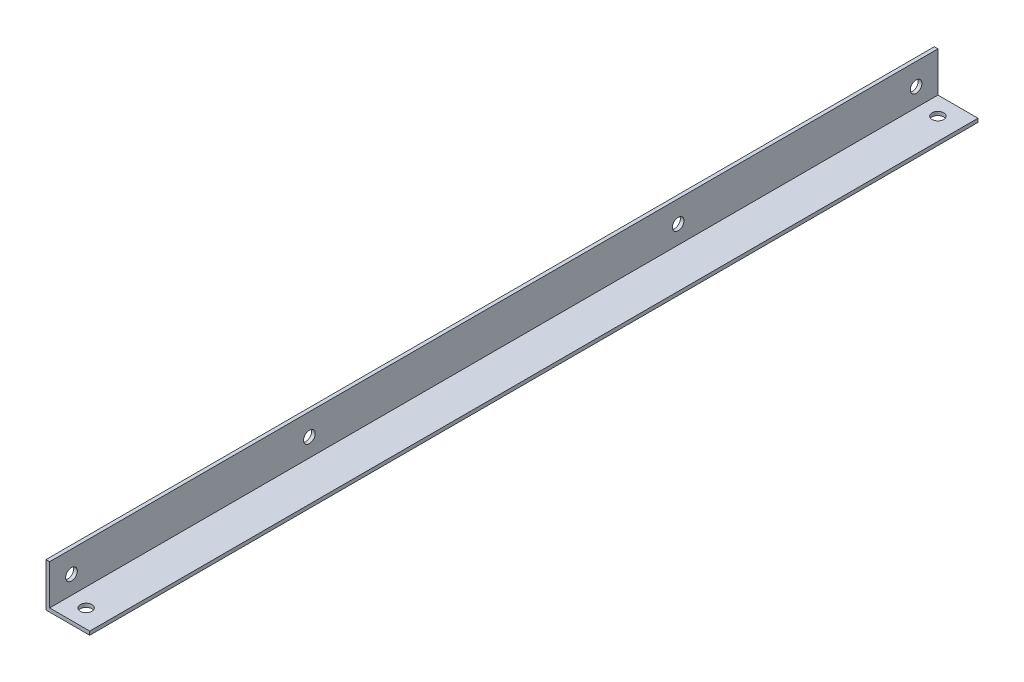
ISO-10303-21;
HEADER;
FILE_DESCRIPTION(('STEP AP214'),'2;1');
FILE_NAME('part.step','',(''),(''),'','','');
FILE_SCHEMA(('AUTOMOTIVE_DESIGN { 1 0 10303 214 1 1 1 1 }'));
ENDSEC;
DATA;
#1=APPLICATION_CONTEXT('core data for automotive mechanical design processes');
#2=APPLICATION_PROTOCOL_DEFINITION('international standard','automotive_design',2000,#1);
#3=PRODUCT_CONTEXT('',#1,'mechanical');
#4=PRODUCT('Part','Part','',(#3));
#5=PRODUCT_RELATED_PRODUCT_CATEGORY('part','',(#4));
#6=PRODUCT_DEFINITION_FORMATION('','',#4);
#7=PRODUCT_DEFINITION_CONTEXT('part definition',#1,'design');
#8=PRODUCT_DEFINITION('design','',#6,#7);
#9=PRODUCT_DEFINITION_SHAPE('','',#8);
#10=(LENGTH_UNIT() NAMED_UNIT(*) SI_UNIT(.MILLI.,.METRE.));
#11=(NAMED_UNIT(*) PLANE_ANGLE_UNIT() SI_UNIT($,.RADIAN.));
#12=(NAMED_UNIT(*) SI_UNIT($,.STERADIAN.) SOLID_ANGLE_UNIT());
#13=UNCERTAINTY_MEASURE_WITH_UNIT(LENGTH_MEASURE(1.E-05),#10,'distance_accuracy_value','');
#14=(GEOMETRIC_REPRESENTATION_CONTEXT(3) GLOBAL_UNCERTAINTY_ASSIGNED_CONTEXT((#13)) GLOBAL_UNIT_ASSIGNED_CONTEXT((#10,
#11,#12)) REPRESENTATION_CONTEXT('',''));
#15=CARTESIAN_POINT('',(0.,0.,0.));
#16=DIRECTION('',(0.,0.,1.));
#17=DIRECTION('',(1.,0.,0.));
#18=AXIS2_PLACEMENT_3D('',#15,#16,#17);
#19=CARTESIAN_POINT('',(30.,0.,609.6));
#20=DIRECTION('',(0.,1.,0.));
#21=DIRECTION('',(-1.,0.,0.));
#22=AXIS2_PLACEMENT_3D('',#19,#20,#21);
#23=PLANE('',#22);
#24=CARTESIAN_POINT('',(15.,0.,597.1));
#25=DIRECTION('',(0.,1.,0.));
#26=DIRECTION('',(1.,0.,0.));
#27=AXIS2_PLACEMENT_3D('',#24,#25,#26);
#28=CIRCLE('',#27,3.99999999999995);
#29=CARTESIAN_POINT('',(11.,0.,597.1));
#30=VERTEX_POINT('',#29);
#31=EDGE_CURVE('E162',#30,#30,#28,.T.);
#32=ORIENTED_EDGE('',*,*,#31,.T.);
#33=EDGE_LOOP('',(#32));
#34=FACE_BOUND('',#33,.T.);
#35=CARTESIAN_POINT('',(15.,0.,12.5));
#36=DIRECTION('',(0.,1.,0.));
#37=DIRECTION('',(-1.,0.,0.));
#38=AXIS2_PLACEMENT_3D('',#35,#36,#37);
#39=CIRCLE('',#38,4.);
#40=CARTESIAN_POINT('',(11.,0.,12.5));
#41=VERTEX_POINT('',#40);
#42=EDGE_CURVE('E165',#41,#41,#39,.T.);
#43=ORIENTED_EDGE('',*,*,#42,.T.);
#44=EDGE_LOOP('',(#43));
#45=FACE_BOUND('',#44,.T.);
#46=DIRECTION('',(1.,0.,0.));
#47=VECTOR('',#46,1.);
#48=CARTESIAN_POINT('',(30.,0.,0.));
#49=LINE('',#48,#47);
#50=CARTESIAN_POINT('',(0.,0.,0.));
#51=VERTEX_POINT('',#50);
#52=CARTESIAN_POINT('',(30.,0.,0.));
#53=VERTEX_POINT('',#52);
#54=EDGE_CURVE('E116',#51,#53,#49,.T.);
#55=ORIENTED_EDGE('',*,*,#54,.T.);
#56=DIRECTION('',(0.,0.,-1.));
#57=VECTOR('',#56,1.);
#58=CARTESIAN_POINT('',(30.,0.,609.6));
#59=LINE('',#58,#57);
#60=CARTESIAN_POINT('',(30.,0.,609.6));
#61=VERTEX_POINT('',#60);
#62=EDGE_CURVE('E11',#61,#53,#59,.T.);
#63=ORIENTED_EDGE('',*,*,#62,.F.);
#64=DIRECTION('',(1.,0.,0.));
#65=VECTOR('',#64,1.);
#66=CARTESIAN_POINT('',(30.,0.,609.6));
#67=LINE('',#66,#65);
#68=CARTESIAN_POINT('',(0.,0.,609.6));
#69=VERTEX_POINT('',#68);
#70=EDGE_CURVE('E127',#69,#61,#67,.T.);
#71=ORIENTED_EDGE('',*,*,#70,.F.);
#72=DIRECTION('',(0.,0.,-1.));
#73=VECTOR('',#72,1.);
#74=CARTESIAN_POINT('',(0.,0.,609.6));
#75=LINE('',#74,#73);
#76=EDGE_CURVE('E112',#69,#51,#75,.T.);
#77=ORIENTED_EDGE('',*,*,#76,.T.);
#78=EDGE_LOOP('',(#55,#63,#71,#77));
#79=FACE_BOUND('',#78,.T.);
#80=ADVANCED_FACE('F32',(#34,#45,#79),#23,.F.);
#81=CARTESIAN_POINT('',(30.,2.5,609.6));
#82=DIRECTION('',(-1.,0.,0.));
#83=DIRECTION('',(0.,0.,1.));
#84=AXIS2_PLACEMENT_3D('',#81,#82,#83);
#85=PLANE('',#84);
#86=DIRECTION('',(0.,1.,0.));
#87=VECTOR('',#86,1.);
#88=CARTESIAN_POINT('',(30.,2.5,0.));
#89=LINE('',#88,#87);
#90=CARTESIAN_POINT('',(30.,2.5,0.));
#91=VERTEX_POINT('',#90);
#92=EDGE_CURVE('E119',#53,#91,#89,.T.);
#93=ORIENTED_EDGE('',*,*,#92,.T.);
#94=DIRECTION('',(0.,0.,-1.));
#95=VECTOR('',#94,1.);
#96=CARTESIAN_POINT('',(30.,2.5,609.6));
#97=LINE('',#96,#95);
#98=CARTESIAN_POINT('',(30.,2.5,609.6));
#99=VERTEX_POINT('',#98);
#100=EDGE_CURVE('E40',#99,#91,#97,.T.);
#101=ORIENTED_EDGE('',*,*,#100,.F.);
#102=DIRECTION('',(0.,1.,0.));
#103=VECTOR('',#102,1.);
#104=CARTESIAN_POINT('',(30.,2.5,609.6));
#105=LINE('',#104,#103);
#106=EDGE_CURVE('E85',#61,#99,#105,.T.);
#107=ORIENTED_EDGE('',*,*,#106,.F.);
#108=ORIENTED_EDGE('',*,*,#62,.T.);
#109=EDGE_LOOP('',(#93,#101,#107,#108));
#110=FACE_BOUND('',#109,.T.);
#111=ADVANCED_FACE('F154',(#110),#85,.F.);
#112=CARTESIAN_POINT('',(2.50000000000001,2.5,609.6));
#113=DIRECTION('',(0.,-1.,0.));
#114=DIRECTION('',(1.,0.,0.));
#115=AXIS2_PLACEMENT_3D('',#112,#113,#114);
#116=PLANE('',#115);
#117=CARTESIAN_POINT('',(15.,2.5,597.1));
#118=DIRECTION('',(0.,1.,0.));
#119=DIRECTION('',(1.,0.,0.));
#120=AXIS2_PLACEMENT_3D('',#117,#118,#119);
#121=CIRCLE('',#120,3.99999999999995);
#122=CARTESIAN_POINT('',(11.,2.5,597.1));
#123=VERTEX_POINT('',#122);
#124=EDGE_CURVE('E176',#123,#123,#121,.T.);
#125=ORIENTED_EDGE('',*,*,#124,.F.);
#126=EDGE_LOOP('',(#125));
#127=FACE_BOUND('',#126,.T.);
#128=CARTESIAN_POINT('',(15.,2.5,12.5));
#129=DIRECTION('',(0.,1.,0.));
#130=DIRECTION('',(-1.,0.,0.));
#131=AXIS2_PLACEMENT_3D('',#128,#129,#130);
#132=CIRCLE('',#131,4.);
#133=CARTESIAN_POINT('',(11.,2.5,12.5));
#134=VERTEX_POINT('',#133);
#135=EDGE_CURVE('E168',#134,#134,#132,.T.);
#136=ORIENTED_EDGE('',*,*,#135,.F.);
#137=EDGE_LOOP('',(#136));
#138=FACE_BOUND('',#137,.T.);
#139=DIRECTION('',(-1.,0.,0.));
#140=VECTOR('',#139,1.);
#141=CARTESIAN_POINT('',(2.50000000000001,2.5,0.));
#142=LINE('',#141,#140);
#143=CARTESIAN_POINT('',(2.50000000000001,2.5,0.));
#144=VERTEX_POINT('',#143);
#145=EDGE_CURVE('E122',#91,#144,#142,.T.);
#146=ORIENTED_EDGE('',*,*,#145,.T.);
#147=DIRECTION('',(0.,0.,-1.));
#148=VECTOR('',#147,1.);
#149=CARTESIAN_POINT('',(2.50000000000001,2.5,609.6));
#150=LINE('',#149,#148);
#151=CARTESIAN_POINT('',(2.50000000000001,2.5,609.6));
#152=VERTEX_POINT('',#151);
#153=EDGE_CURVE('E107',#152,#144,#150,.T.);
#154=ORIENTED_EDGE('',*,*,#153,.F.);
#155=DIRECTION('',(-1.,0.,0.));
#156=VECTOR('',#155,1.);
#157=CARTESIAN_POINT('',(2.50000000000001,2.5,609.6));
#158=LINE('',#157,#156);
#159=EDGE_CURVE('E98',#99,#152,#158,.T.);
#160=ORIENTED_EDGE('',*,*,#159,.F.);
#161=ORIENTED_EDGE('',*,*,#100,.T.);
#162=EDGE_LOOP('',(#146,#154,#160,#161));
#163=FACE_BOUND('',#162,.T.);
#164=ADVANCED_FACE('F133',(#127,#138,#163),#116,.F.);
#165=CARTESIAN_POINT('',(2.5,30.,609.6));
#166=DIRECTION('',(-1.,0.,0.));
#167=DIRECTION('',(0.,-1.,0.));
#168=AXIS2_PLACEMENT_3D('',#165,#166,#167);
#169=PLANE('',#168);
#170=CARTESIAN_POINT('',(2.5,15.,178.2565237));
#171=DIRECTION('',(1.,0.,0.));
#172=DIRECTION('',(0.,-1.,0.));
#173=AXIS2_PLACEMENT_3D('',#170,#171,#172);
#174=CIRCLE('',#173,3.99999999999999);
#175=CARTESIAN_POINT('',(2.5,11.,178.2565237));
#176=VERTEX_POINT('',#175);
#177=EDGE_CURVE('E167',#176,#176,#174,.T.);
#178=ORIENTED_EDGE('',*,*,#177,.F.);
#179=EDGE_LOOP('',(#178));
#180=FACE_BOUND('',#179,.T.);
#181=CARTESIAN_POINT('',(2.5,15.,431.3434763));
#182=DIRECTION('',(1.,0.,0.));
#183=DIRECTION('',(0.,1.,0.));
#184=AXIS2_PLACEMENT_3D('',#181,#182,#183);
#185=CIRCLE('',#184,3.99999999999999);
#186=CARTESIAN_POINT('',(2.5,19.,431.3434763));
#187=VERTEX_POINT('',#186);
#188=EDGE_CURVE('E179',#187,#187,#185,.T.);
#189=ORIENTED_EDGE('',*,*,#188,.F.);
#190=EDGE_LOOP('',(#189));
#191=FACE_BOUND('',#190,.T.);
#192=CARTESIAN_POINT('',(2.5,15.,15.));
#193=DIRECTION('',(1.,0.,0.));
#194=DIRECTION('',(0.,-1.,0.));
#195=AXIS2_PLACEMENT_3D('',#192,#193,#194);
#196=CIRCLE('',#195,3.99999999999999);
#197=CARTESIAN_POINT('',(2.5,11.,15.));
#198=VERTEX_POINT('',#197);
#199=EDGE_CURVE('E184',#198,#198,#196,.T.);
#200=ORIENTED_EDGE('',*,*,#199,.F.);
#201=EDGE_LOOP('',(#200));
#202=FACE_BOUND('',#201,.T.);
#203=CARTESIAN_POINT('',(2.5,14.9999999999999,594.6));
#204=DIRECTION('',(1.,0.,0.));
#205=DIRECTION('',(0.,1.,0.));
#206=AXIS2_PLACEMENT_3D('',#203,#204,#205);
#207=CIRCLE('',#206,3.99999999999999);
#208=CARTESIAN_POINT('',(2.5,18.9999999999999,594.6));
#209=VERTEX_POINT('',#208);
#210=EDGE_CURVE('E190',#209,#209,#207,.T.);
#211=ORIENTED_EDGE('',*,*,#210,.F.);
#212=EDGE_LOOP('',(#211));
#213=FACE_BOUND('',#212,.T.);
#214=DIRECTION('',(0.,1.,0.));
#215=VECTOR('',#214,1.);
#216=CARTESIAN_POINT('',(2.5,30.,0.));
#217=LINE('',#216,#215);
#218=CARTESIAN_POINT('',(2.5,30.,0.));
#219=VERTEX_POINT('',#218);
#220=EDGE_CURVE('E106',#144,#219,#217,.T.);
#221=ORIENTED_EDGE('',*,*,#220,.T.);
#222=DIRECTION('',(0.,0.,-1.));
#223=VECTOR('',#222,1.);
#224=CARTESIAN_POINT('',(2.5,30.,609.6));
#225=LINE('',#224,#223);
#226=CARTESIAN_POINT('',(2.5,30.,609.6));
#227=VERTEX_POINT('',#226);
#228=EDGE_CURVE('E103',#227,#219,#225,.T.);
#229=ORIENTED_EDGE('',*,*,#228,.F.);
#230=DIRECTION('',(0.,1.,0.));
#231=VECTOR('',#230,1.);
#232=CARTESIAN_POINT('',(2.5,30.,609.6));
#233=LINE('',#232,#231);
#234=EDGE_CURVE('E92',#152,#227,#233,.T.);
#235=ORIENTED_EDGE('',*,*,#234,.F.);
#236=ORIENTED_EDGE('',*,*,#153,.T.);
#237=EDGE_LOOP('',(#221,#229,#235,#236));
#238=FACE_BOUND('',#237,.T.);
#239=ADVANCED_FACE('F104',(#180,#191,#202,#213,#238),#169,.F.);
#240=CARTESIAN_POINT('',(0.,30.,609.6));
#241=DIRECTION('',(0.,-1.,0.));
#242=DIRECTION('',(0.,0.,-1.));
#243=AXIS2_PLACEMENT_3D('',#240,#241,#242);
#244=PLANE('',#243);
#245=DIRECTION('',(-1.,0.,0.));
#246=VECTOR('',#245,1.);
#247=CARTESIAN_POINT('',(0.,30.,0.));
#248=LINE('',#247,#246);
#249=CARTESIAN_POINT('',(0.,30.,0.));
#250=VERTEX_POINT('',#249);
#251=EDGE_CURVE('E71',#219,#250,#248,.T.);
#252=ORIENTED_EDGE('',*,*,#251,.T.);
#253=DIRECTION('',(0.,0.,-1.));
#254=VECTOR('',#253,1.);
#255=CARTESIAN_POINT('',(0.,30.,609.6));
#256=LINE('',#255,#254);
#257=CARTESIAN_POINT('',(0.,30.,609.6));
#258=VERTEX_POINT('',#257);
#259=EDGE_CURVE('E108',#258,#250,#256,.T.);
#260=ORIENTED_EDGE('',*,*,#259,.F.);
#261=DIRECTION('',(-1.,0.,0.));
#262=VECTOR('',#261,1.);
#263=CARTESIAN_POINT('',(0.,30.,609.6));
#264=LINE('',#263,#262);
#265=EDGE_CURVE('E96',#227,#258,#264,.T.);
#266=ORIENTED_EDGE('',*,*,#265,.F.);
#267=ORIENTED_EDGE('',*,*,#228,.T.);
#268=EDGE_LOOP('',(#252,#260,#266,#267));
#269=FACE_BOUND('',#268,.T.);
#270=ADVANCED_FACE('F110',(#269),#244,.F.);
#271=CARTESIAN_POINT('',(0.,0.,609.6));
#272=DIRECTION('',(1.,0.,0.));
#273=DIRECTION('',(0.,0.,-1.));
#274=AXIS2_PLACEMENT_3D('',#271,#272,#273);
#275=PLANE('',#274);
#276=CARTESIAN_POINT('',(0.,15.,178.2565237));
#277=DIRECTION('',(1.,0.,0.));
#278=DIRECTION('',(0.,-1.,0.));
#279=AXIS2_PLACEMENT_3D('',#276,#277,#278);
#280=CIRCLE('',#279,3.99999999999999);
#281=CARTESIAN_POINT('',(0.,11.,178.2565237));
#282=VERTEX_POINT('',#281);
#283=EDGE_CURVE('E171',#282,#282,#280,.T.);
#284=ORIENTED_EDGE('',*,*,#283,.T.);
#285=EDGE_LOOP('',(#284));
#286=FACE_BOUND('',#285,.T.);
#287=CARTESIAN_POINT('',(0.,15.,431.3434763));
#288=DIRECTION('',(1.,0.,0.));
#289=DIRECTION('',(0.,1.,0.));
#290=AXIS2_PLACEMENT_3D('',#287,#288,#289);
#291=CIRCLE('',#290,3.99999999999999);
#292=CARTESIAN_POINT('',(0.,19.,431.3434763));
#293=VERTEX_POINT('',#292);
#294=EDGE_CURVE('E181',#293,#293,#291,.T.);
#295=ORIENTED_EDGE('',*,*,#294,.T.);
#296=EDGE_LOOP('',(#295));
#297=FACE_BOUND('',#296,.T.);
#298=CARTESIAN_POINT('',(0.,15.,15.));
#299=DIRECTION('',(1.,0.,0.));
#300=DIRECTION('',(0.,-1.,0.));
#301=AXIS2_PLACEMENT_3D('',#298,#299,#300);
#302=CIRCLE('',#301,3.99999999999999);
#303=CARTESIAN_POINT('',(0.,11.,15.));
#304=VERTEX_POINT('',#303);
#305=EDGE_CURVE('E187',#304,#304,#302,.T.);
#306=ORIENTED_EDGE('',*,*,#305,.T.);
#307=EDGE_LOOP('',(#306));
#308=FACE_BOUND('',#307,.T.);
#309=CARTESIAN_POINT('',(0.,14.9999999999999,594.6));
#310=DIRECTION('',(1.,0.,0.));
#311=DIRECTION('',(0.,1.,0.));
#312=AXIS2_PLACEMENT_3D('',#309,#310,#311);
#313=CIRCLE('',#312,3.99999999999999);
#314=CARTESIAN_POINT('',(0.,18.9999999999999,594.6));
#315=VERTEX_POINT('',#314);
#316=EDGE_CURVE('E120',#315,#315,#313,.T.);
#317=ORIENTED_EDGE('',*,*,#316,.T.);
#318=EDGE_LOOP('',(#317));
#319=FACE_BOUND('',#318,.T.);
#320=DIRECTION('',(0.,-1.,0.));
#321=VECTOR('',#320,1.);
#322=CARTESIAN_POINT('',(0.,0.,0.));
#323=LINE('',#322,#321);
#324=EDGE_CURVE('E77',#250,#51,#323,.T.);
#325=ORIENTED_EDGE('',*,*,#324,.T.);
#326=ORIENTED_EDGE('',*,*,#76,.F.);
#327=DIRECTION('',(0.,-1.,0.));
#328=VECTOR('',#327,1.);
#329=CARTESIAN_POINT('',(0.,0.,609.6));
#330=LINE('',#329,#328);
#331=EDGE_CURVE('E48',#258,#69,#330,.T.);
#332=ORIENTED_EDGE('',*,*,#331,.F.);
#333=ORIENTED_EDGE('',*,*,#259,.T.);
#334=EDGE_LOOP('',(#325,#326,#332,#333));
#335=FACE_BOUND('',#334,.T.);
#336=ADVANCED_FACE('F140',(#286,#297,#308,#319,#335),#275,.F.);
#337=CARTESIAN_POINT('',(0.,0.,609.6));
#338=DIRECTION('',(0.,0.,-1.));
#339=DIRECTION('',(-1.,0.,0.));
#340=AXIS2_PLACEMENT_3D('',#337,#338,#339);
#341=PLANE('',#340);
#342=ORIENTED_EDGE('',*,*,#70,.T.);
#343=ORIENTED_EDGE('',*,*,#106,.T.);
#344=ORIENTED_EDGE('',*,*,#159,.T.);
#345=ORIENTED_EDGE('',*,*,#234,.T.);
#346=ORIENTED_EDGE('',*,*,#265,.T.);
#347=ORIENTED_EDGE('',*,*,#331,.T.);
#348=EDGE_LOOP('',(#342,#343,#344,#345,#346,#347));
#349=FACE_BOUND('',#348,.T.);
#350=ADVANCED_FACE('F94',(#349),#341,.F.);
#351=CARTESIAN_POINT('',(0.,0.,0.));
#352=DIRECTION('',(0.,0.,-1.));
#353=DIRECTION('',(-1.,0.,0.));
#354=AXIS2_PLACEMENT_3D('',#351,#352,#353);
#355=PLANE('',#354);
#356=ORIENTED_EDGE('',*,*,#54,.F.);
#357=ORIENTED_EDGE('',*,*,#324,.F.);
#358=ORIENTED_EDGE('',*,*,#251,.F.);
#359=ORIENTED_EDGE('',*,*,#220,.F.);
#360=ORIENTED_EDGE('',*,*,#145,.F.);
#361=ORIENTED_EDGE('',*,*,#92,.F.);
#362=EDGE_LOOP('',(#356,#357,#358,#359,#360,#361));
#363=FACE_BOUND('',#362,.T.);
#364=ADVANCED_FACE('F136',(#363),#355,.T.);
#365=CARTESIAN_POINT('',(0.,14.9999999999999,594.6));
#366=DIRECTION('',(1.,0.,0.));
#367=DIRECTION('',(0.,1.,0.));
#368=AXIS2_PLACEMENT_3D('',#365,#366,#367);
#369=CYLINDRICAL_SURFACE('',#368,3.99999999999999);
#370=ORIENTED_EDGE('',*,*,#316,.F.);
#371=EDGE_LOOP('',(#370));
#372=FACE_BOUND('',#371,.T.);
#373=ORIENTED_EDGE('',*,*,#210,.T.);
#374=EDGE_LOOP('',(#373));
#375=FACE_BOUND('',#374,.T.);
#376=ADVANCED_FACE('F200',(#372,#375),#369,.F.);
#377=CARTESIAN_POINT('',(0.,15.,15.));
#378=DIRECTION('',(1.,0.,0.));
#379=DIRECTION('',(0.,1.,0.));
#380=AXIS2_PLACEMENT_3D('',#377,#378,#379);
#381=CYLINDRICAL_SURFACE('',#380,3.99999999999999);
#382=ORIENTED_EDGE('',*,*,#305,.F.);
#383=EDGE_LOOP('',(#382));
#384=FACE_BOUND('',#383,.T.);
#385=ORIENTED_EDGE('',*,*,#199,.T.);
#386=EDGE_LOOP('',(#385));
#387=FACE_BOUND('',#386,.T.);
#388=ADVANCED_FACE('F216',(#384,#387),#381,.F.);
#389=CARTESIAN_POINT('',(0.,15.,431.3434763));
#390=DIRECTION('',(1.,0.,0.));
#391=DIRECTION('',(0.,1.,0.));
#392=AXIS2_PLACEMENT_3D('',#389,#390,#391);
#393=CYLINDRICAL_SURFACE('',#392,3.99999999999999);
#394=ORIENTED_EDGE('',*,*,#294,.F.);
#395=EDGE_LOOP('',(#394));
#396=FACE_BOUND('',#395,.T.);
#397=ORIENTED_EDGE('',*,*,#188,.T.);
#398=EDGE_LOOP('',(#397));
#399=FACE_BOUND('',#398,.T.);
#400=ADVANCED_FACE('F218',(#396,#399),#393,.F.);
#401=CARTESIAN_POINT('',(0.,15.,178.2565237));
#402=DIRECTION('',(1.,0.,0.));
#403=DIRECTION('',(0.,1.,0.));
#404=AXIS2_PLACEMENT_3D('',#401,#402,#403);
#405=CYLINDRICAL_SURFACE('',#404,3.99999999999999);
#406=ORIENTED_EDGE('',*,*,#283,.F.);
#407=EDGE_LOOP('',(#406));
#408=FACE_BOUND('',#407,.T.);
#409=ORIENTED_EDGE('',*,*,#177,.T.);
#410=EDGE_LOOP('',(#409));
#411=FACE_BOUND('',#410,.T.);
#412=ADVANCED_FACE('F225',(#408,#411),#405,.F.);
#413=CARTESIAN_POINT('',(15.,0.,12.5));
#414=DIRECTION('',(0.,1.,0.));
#415=DIRECTION('',(-1.,0.,0.));
#416=AXIS2_PLACEMENT_3D('',#413,#414,#415);
#417=CYLINDRICAL_SURFACE('',#416,4.);
#418=CARTESIAN_POINT('',(11.,0.,12.5));
#419=CARTESIAN_POINT('',(11.,0.0260416666666613,12.5));
#420=CARTESIAN_POINT('',(11.,0.052083333333328,12.5));
#421=CARTESIAN_POINT('',(11.,0.104166666666661,12.5));
#422=CARTESIAN_POINT('',(11.,0.130208333333328,12.5));
#423=CARTESIAN_POINT('',(11.,0.182291666666662,12.5));
#424=CARTESIAN_POINT('',(11.,0.208333333333328,12.5));
#425=CARTESIAN_POINT('',(11.,0.260416666666662,12.5));
#426=CARTESIAN_POINT('',(11.,0.286458333333328,12.5));
#427=CARTESIAN_POINT('',(11.,0.338541666666662,12.5));
#428=CARTESIAN_POINT('',(11.,0.364583333333329,12.5));
#429=CARTESIAN_POINT('',(11.,0.416666666666662,12.5));
#430=CARTESIAN_POINT('',(11.,0.442708333333329,12.5));
#431=CARTESIAN_POINT('',(11.,0.494791666666662,12.5));
#432=CARTESIAN_POINT('',(11.,0.520833333333329,12.5));
#433=CARTESIAN_POINT('',(11.,0.572916666666662,12.5));
#434=CARTESIAN_POINT('',(11.,0.598958333333329,12.5));
#435=CARTESIAN_POINT('',(11.,0.651041666666663,12.5));
#436=CARTESIAN_POINT('',(11.,0.677083333333329,12.5));
#437=CARTESIAN_POINT('',(11.,0.729166666666663,12.5));
#438=CARTESIAN_POINT('',(11.,0.755208333333329,12.5));
#439=CARTESIAN_POINT('',(11.,0.807291666666663,12.5));
#440=CARTESIAN_POINT('',(11.,0.83333333333333,12.5));
#441=CARTESIAN_POINT('',(11.,0.885416666666663,12.5));
#442=CARTESIAN_POINT('',(11.,0.91145833333333,12.5));
#443=CARTESIAN_POINT('',(11.,0.963541666666663,12.5));
#444=CARTESIAN_POINT('',(11.,0.98958333333333,12.5));
#445=CARTESIAN_POINT('',(11.,1.04166666666666,12.5));
#446=CARTESIAN_POINT('',(11.,1.06770833333333,12.5));
#447=CARTESIAN_POINT('',(11.,1.11979166666666,12.5));
#448=CARTESIAN_POINT('',(11.,1.14583333333333,12.5));
#449=CARTESIAN_POINT('',(11.,1.19791666666666,12.5));
#450=CARTESIAN_POINT('',(11.,1.22395833333333,12.5));
#451=CARTESIAN_POINT('',(11.,1.27604166666666,12.5));
#452=CARTESIAN_POINT('',(11.,1.30208333333333,12.5));
#453=CARTESIAN_POINT('',(11.,1.35416666666666,12.5));
#454=CARTESIAN_POINT('',(11.,1.38020833333333,12.5));
#455=CARTESIAN_POINT('',(11.,1.43229166666666,12.5));
#456=CARTESIAN_POINT('',(11.,1.45833333333333,12.5));
#457=CARTESIAN_POINT('',(11.,1.51041666666666,12.5));
#458=CARTESIAN_POINT('',(11.,1.53645833333333,12.5));
#459=CARTESIAN_POINT('',(11.,1.58854166666666,12.5));
#460=CARTESIAN_POINT('',(11.,1.61458333333333,12.5));
#461=CARTESIAN_POINT('',(11.,1.66666666666666,12.5));
#462=CARTESIAN_POINT('',(11.,1.69270833333333,12.5));
#463=CARTESIAN_POINT('',(11.,1.74479166666667,12.5));
#464=CARTESIAN_POINT('',(11.,1.77083333333333,12.5));
#465=CARTESIAN_POINT('',(11.,1.82291666666667,12.5));
#466=CARTESIAN_POINT('',(11.,1.84895833333333,12.5));
#467=CARTESIAN_POINT('',(11.,1.90104166666667,12.5));
#468=CARTESIAN_POINT('',(11.,1.92708333333333,12.5));
#469=CARTESIAN_POINT('',(11.,1.97916666666667,12.5));
#470=CARTESIAN_POINT('',(11.,2.00520833333333,12.5));
#471=CARTESIAN_POINT('',(11.,2.05729166666667,12.5));
#472=CARTESIAN_POINT('',(11.,2.08333333333333,12.5));
#473=CARTESIAN_POINT('',(11.,2.13541666666667,12.5));
#474=CARTESIAN_POINT('',(11.,2.16145833333333,12.5));
#475=CARTESIAN_POINT('',(11.,2.21354166666667,12.5));
#476=CARTESIAN_POINT('',(11.,2.23958333333333,12.5));
#477=CARTESIAN_POINT('',(11.,2.29166666666667,12.5));
#478=CARTESIAN_POINT('',(11.,2.31770833333333,12.5));
#479=CARTESIAN_POINT('',(11.,2.36979166666667,12.5));
#480=CARTESIAN_POINT('',(11.,2.39583333333333,12.5));
#481=CARTESIAN_POINT('',(11.,2.44791666666667,12.5));
#482=CARTESIAN_POINT('',(11.,2.47395833333333,12.5));
#483=CARTESIAN_POINT('',(11.,2.5,12.5));
#484=B_SPLINE_CURVE_WITH_KNOTS('',3,(#418,#419,#420,#421,#422,#423,#424,#425,#426,#427,#428,
#429,#430,#431,#432,#433,#434,#435,#436,#437,#438,#439,#440,#441,#442,#443,#444,#445,#446,#447,
#448,#449,#450,#451,#452,#453,#454,#455,#456,#457,#458,#459,#460,#461,#462,#463,#464,#465,#466,
#467,#468,#469,#470,#471,#472,#473,#474,#475,#476,#477,#478,#479,#480,#481,#482,#483),
.UNSPECIFIED.,.F.,.F.,(4,2,2,2,2,2,2,2,2,2,2,2,2,2,2,2,2,2,2,2,2,2,2,2,2,2,2,2,2,2,2,2,4),(0.,
0.0781250000000002,0.15625,0.234375,0.312500000000001,0.390625000000001,0.468750000000001,
0.546875000000001,0.625000000000001,0.703125000000001,0.781250000000002,0.859375000000002,
0.937500000000002,1.015625,1.09375,1.171875,1.25,1.328125,1.40625,1.484375,1.5625,1.640625,
1.71875,1.796875,1.875,1.953125,2.03125,2.109375,2.1875,2.265625,2.34375,2.421875,2.5),.UNSPECIFIED.);
#485=EDGE_CURVE('BSEAM261',#41,#134,#484,.T.);
#486=ORIENTED_EDGE('',*,*,#42,.F.);
#487=ORIENTED_EDGE('',*,*,#135,.T.);
#488=ORIENTED_EDGE('',*,*,#485,.T.);
#489=ORIENTED_EDGE('',*,*,#485,.F.);
#490=EDGE_LOOP('',(#486,#488,#487,#489));
#491=FACE_BOUND('',#490,.T.);
#492=ADVANCED_FACE('F261',(#491),#417,.F.);
#493=CARTESIAN_POINT('',(15.,0.,597.1));
#494=DIRECTION('',(0.,1.,0.));
#495=DIRECTION('',(-1.,0.,0.));
#496=AXIS2_PLACEMENT_3D('',#493,#494,#495);
#497=CYLINDRICAL_SURFACE('',#496,3.99999999999995);
#498=CARTESIAN_POINT('',(11.,0.,597.1));
#499=CARTESIAN_POINT('',(11.,0.0260416666666613,597.1));
#500=CARTESIAN_POINT('',(11.,0.052083333333328,597.1));
#501=CARTESIAN_POINT('',(11.,0.104166666666661,597.1));
#502=CARTESIAN_POINT('',(11.,0.130208333333328,597.1));
#503=CARTESIAN_POINT('',(11.,0.182291666666662,597.1));
#504=CARTESIAN_POINT('',(11.,0.208333333333328,597.1));
#505=CARTESIAN_POINT('',(11.,0.260416666666662,597.1));
#506=CARTESIAN_POINT('',(11.,0.286458333333328,597.1));
#507=CARTESIAN_POINT('',(11.,0.338541666666662,597.1));
#508=CARTESIAN_POINT('',(11.,0.364583333333329,597.1));
#509=CARTESIAN_POINT('',(11.,0.416666666666662,597.1));
#510=CARTESIAN_POINT('',(11.,0.442708333333329,597.1));
#511=CARTESIAN_POINT('',(11.,0.494791666666662,597.1));
#512=CARTESIAN_POINT('',(11.,0.520833333333329,597.1));
#513=CARTESIAN_POINT('',(11.,0.572916666666662,597.1));
#514=CARTESIAN_POINT('',(11.,0.598958333333329,597.1));
#515=CARTESIAN_POINT('',(11.,0.651041666666663,597.1));
#516=CARTESIAN_POINT('',(11.,0.677083333333329,597.1));
#517=CARTESIAN_POINT('',(11.,0.729166666666663,597.1));
#518=CARTESIAN_POINT('',(11.,0.755208333333329,597.1));
#519=CARTESIAN_POINT('',(11.,0.807291666666663,597.1));
#520=CARTESIAN_POINT('',(11.,0.83333333333333,597.1));
#521=CARTESIAN_POINT('',(11.,0.885416666666663,597.1));
#522=CARTESIAN_POINT('',(11.,0.91145833333333,597.1));
#523=CARTESIAN_POINT('',(11.,0.963541666666663,597.1));
#524=CARTESIAN_POINT('',(11.,0.98958333333333,597.1));
#525=CARTESIAN_POINT('',(11.,1.04166666666666,597.1));
#526=CARTESIAN_POINT('',(11.,1.06770833333333,597.1));
#527=CARTESIAN_POINT('',(11.,1.11979166666666,597.1));
#528=CARTESIAN_POINT('',(11.,1.14583333333333,597.1));
#529=CARTESIAN_POINT('',(11.,1.19791666666666,597.1));
#530=CARTESIAN_POINT('',(11.,1.22395833333333,597.1));
#531=CARTESIAN_POINT('',(11.,1.27604166666666,597.1));
#532=CARTESIAN_POINT('',(11.,1.30208333333333,597.1));
#533=CARTESIAN_POINT('',(11.,1.35416666666666,597.1));
#534=CARTESIAN_POINT('',(11.,1.38020833333333,597.1));
#535=CARTESIAN_POINT('',(11.,1.43229166666666,597.1));
#536=CARTESIAN_POINT('',(11.,1.45833333333333,597.1));
#537=CARTESIAN_POINT('',(11.,1.51041666666666,597.1));
#538=CARTESIAN_POINT('',(11.,1.53645833333333,597.1));
#539=CARTESIAN_POINT('',(11.,1.58854166666666,597.1));
#540=CARTESIAN_POINT('',(11.,1.61458333333333,597.1));
#541=CARTESIAN_POINT('',(11.,1.66666666666666,597.1));
#542=CARTESIAN_POINT('',(11.,1.69270833333333,597.1));
#543=CARTESIAN_POINT('',(11.,1.74479166666667,597.1));
#544=CARTESIAN_POINT('',(11.,1.77083333333333,597.1));
#545=CARTESIAN_POINT('',(11.,1.82291666666667,597.1));
#546=CARTESIAN_POINT('',(11.,1.84895833333333,597.1));
#547=CARTESIAN_POINT('',(11.,1.90104166666667,597.1));
#548=CARTESIAN_POINT('',(11.,1.92708333333333,597.1));
#549=CARTESIAN_POINT('',(11.,1.97916666666667,597.1));
#550=CARTESIAN_POINT('',(11.,2.00520833333333,597.1));
#551=CARTESIAN_POINT('',(11.,2.05729166666667,597.1));
#552=CARTESIAN_POINT('',(11.,2.08333333333333,597.1));
#553=CARTESIAN_POINT('',(11.,2.13541666666667,597.1));
#554=CARTESIAN_POINT('',(11.,2.16145833333333,597.1));
#555=CARTESIAN_POINT('',(11.,2.21354166666667,597.1));
#556=CARTESIAN_POINT('',(11.,2.23958333333333,597.1));
#557=CARTESIAN_POINT('',(11.,2.29166666666667,597.1));
#558=CARTESIAN_POINT('',(11.,2.31770833333333,597.1));
#559=CARTESIAN_POINT('',(11.,2.36979166666667,597.1));
#560=CARTESIAN_POINT('',(11.,2.39583333333333,597.1));
#561=CARTESIAN_POINT('',(11.,2.44791666666667,597.1));
#562=CARTESIAN_POINT('',(11.,2.47395833333333,597.1));
#563=CARTESIAN_POINT('',(11.,2.5,597.1));
#564=B_SPLINE_CURVE_WITH_KNOTS('',3,(#498,#499,#500,#501,#502,#503,#504,#505,#506,#507,#508,
#509,#510,#511,#512,#513,#514,#515,#516,#517,#518,#519,#520,#521,#522,#523,#524,#525,#526,#527,
#528,#529,#530,#531,#532,#533,#534,#535,#536,#537,#538,#539,#540,#541,#542,#543,#544,#545,#546,
#547,#548,#549,#550,#551,#552,#553,#554,#555,#556,#557,#558,#559,#560,#561,#562,#563),
.UNSPECIFIED.,.F.,.F.,(4,2,2,2,2,2,2,2,2,2,2,2,2,2,2,2,2,2,2,2,2,2,2,2,2,2,2,2,2,2,2,2,4),(0.,
0.0781250000000002,0.15625,0.234375,0.312500000000001,0.390625000000001,0.468750000000001,
0.546875000000001,0.625000000000001,0.703125000000001,0.781250000000002,0.859375000000002,
0.937500000000002,1.015625,1.09375,1.171875,1.25,1.328125,1.40625,1.484375,1.5625,1.640625,
1.71875,1.796875,1.875,1.953125,2.03125,2.109375,2.1875,2.265625,2.34375,2.421875,2.5),.UNSPECIFIED.);
#565=EDGE_CURVE('BSEAM283',#30,#123,#564,.T.);
#566=ORIENTED_EDGE('',*,*,#31,.F.);
#567=ORIENTED_EDGE('',*,*,#124,.T.);
#568=ORIENTED_EDGE('',*,*,#565,.T.);
#569=ORIENTED_EDGE('',*,*,#565,.F.);
#570=EDGE_LOOP('',(#566,#568,#567,#569));
#571=FACE_BOUND('',#570,.T.);
#572=ADVANCED_FACE('F283',(#571),#497,.F.);
#573=CLOSED_SHELL('',(#80,#111,#164,#239,#270,#336,#350,#364,#376,#388,#400,#412,#492,#572));
#574=MANIFOLD_SOLID_BREP('B2',#573);
#575=ADVANCED_BREP_SHAPE_REPRESENTATION('',(#18,#574),#14);
#576=SHAPE_DEFINITION_REPRESENTATION(#9,#575);
ENDSEC;
END-ISO-10303-21;
